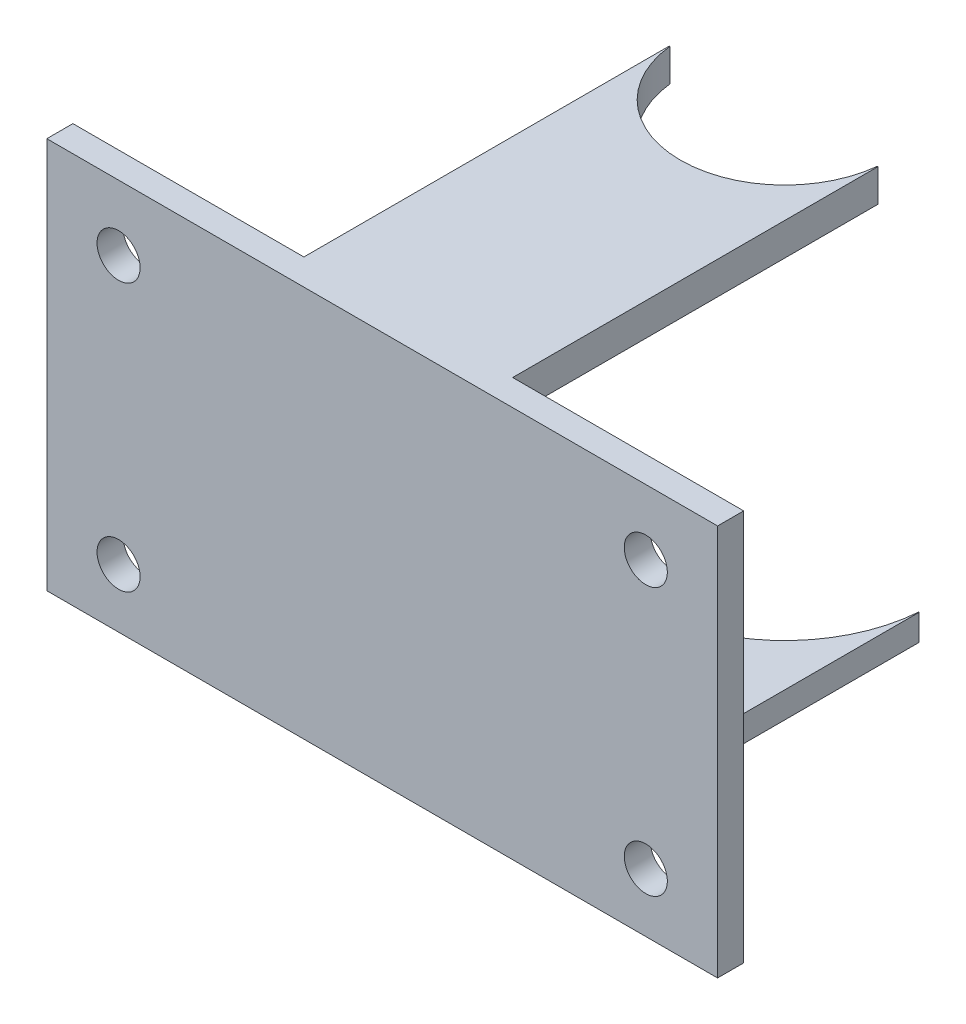
ISO-10303-21;
HEADER;
FILE_DESCRIPTION(('STEP AP214'),'2;1');
FILE_NAME('part.step','',(''),(''),'','','');
FILE_SCHEMA(('AUTOMOTIVE_DESIGN { 1 0 10303 214 1 1 1 1 }'));
ENDSEC;
DATA;
#1=APPLICATION_CONTEXT('core data for automotive mechanical design processes');
#2=APPLICATION_PROTOCOL_DEFINITION('international standard','automotive_design',2000,#1);
#3=PRODUCT_CONTEXT('',#1,'mechanical');
#4=PRODUCT('Part','Part','',(#3));
#5=PRODUCT_RELATED_PRODUCT_CATEGORY('part','',(#4));
#6=PRODUCT_DEFINITION_FORMATION('','',#4);
#7=PRODUCT_DEFINITION_CONTEXT('part definition',#1,'design');
#8=PRODUCT_DEFINITION('design','',#6,#7);
#9=PRODUCT_DEFINITION_SHAPE('','',#8);
#10=(LENGTH_UNIT() NAMED_UNIT(*) SI_UNIT(.MILLI.,.METRE.));
#11=(NAMED_UNIT(*) PLANE_ANGLE_UNIT() SI_UNIT($,.RADIAN.));
#12=(NAMED_UNIT(*) SI_UNIT($,.STERADIAN.) SOLID_ANGLE_UNIT());
#13=UNCERTAINTY_MEASURE_WITH_UNIT(LENGTH_MEASURE(1.E-05),#10,'distance_accuracy_value','');
#14=(GEOMETRIC_REPRESENTATION_CONTEXT(3) GLOBAL_UNCERTAINTY_ASSIGNED_CONTEXT((#13)) GLOBAL_UNIT_ASSIGNED_CONTEXT((#10,
#11,#12)) REPRESENTATION_CONTEXT('',''));
#15=CARTESIAN_POINT('',(0.,0.,0.));
#16=DIRECTION('',(0.,0.,1.));
#17=DIRECTION('',(1.,0.,0.));
#18=AXIS2_PLACEMENT_3D('',#15,#16,#17);
#19=CARTESIAN_POINT('',(0.,0.,-28.));
#20=DIRECTION('',(0.,0.,-1.));
#21=DIRECTION('',(-1.,0.,0.));
#22=AXIS2_PLACEMENT_3D('',#19,#20,#21);
#23=PLANE('',#22);
#24=DIRECTION('',(0.,1.,0.));
#25=VECTOR('',#24,1.);
#26=CARTESIAN_POINT('',(14.5824463122502,-8.00000000000001,-28.));
#27=LINE('',#26,#25);
#28=CARTESIAN_POINT('',(14.5824463122502,0.,-28.));
#29=VERTEX_POINT('',#28);
#30=CARTESIAN_POINT('',(14.5824463122502,1.99999999999999,-28.));
#31=VERTEX_POINT('',#30);
#32=EDGE_CURVE('E11',#29,#31,#27,.T.);
#33=ORIENTED_EDGE('',*,*,#32,.F.);
#34=DIRECTION('',(-1.,0.,0.));
#35=VECTOR('',#34,1.);
#36=CARTESIAN_POINT('',(36.85,0.,-28.));
#37=LINE('',#36,#35);
#38=CARTESIAN_POINT('',(14.55,0.,-28.));
#39=VERTEX_POINT('',#38);
#40=EDGE_CURVE('E285',#29,#39,#37,.T.);
#41=ORIENTED_EDGE('',*,*,#40,.T.);
#42=DIRECTION('',(0.,1.,0.));
#43=VECTOR('',#42,1.);
#44=CARTESIAN_POINT('',(14.55,1.99999999999999,-28.));
#45=LINE('',#44,#43);
#46=CARTESIAN_POINT('',(14.55,1.99999999999999,-28.));
#47=VERTEX_POINT('',#46);
#48=EDGE_CURVE('E158',#39,#47,#45,.T.);
#49=ORIENTED_EDGE('',*,*,#48,.T.);
#50=DIRECTION('',(1.,0.,0.));
#51=VECTOR('',#50,1.);
#52=CARTESIAN_POINT('',(36.85,1.99999999999999,-28.));
#53=LINE('',#52,#51);
#54=EDGE_CURVE('E153',#47,#31,#53,.T.);
#55=ORIENTED_EDGE('',*,*,#54,.T.);
#56=EDGE_LOOP('',(#33,#41,#49,#55));
#57=FACE_BOUND('',#56,.T.);
#58=ADVANCED_FACE('F33',(#57),#23,.T.);
#59=CARTESIAN_POINT('',(0.,0.,-28.));
#60=DIRECTION('',(0.,0.,1.));
#61=DIRECTION('',(1.,0.,0.));
#62=AXIS2_PLACEMENT_3D('',#59,#60,#61);
#63=PLANE('',#62);
#64=DIRECTION('',(-1.,0.,0.));
#65=VECTOR('',#64,1.);
#66=CARTESIAN_POINT('',(33.7,27.5,-28.));
#67=LINE('',#66,#65);
#68=CARTESIAN_POINT('',(33.7,27.5,-28.));
#69=VERTEX_POINT('',#68);
#70=CARTESIAN_POINT('',(33.6547155825962,27.5,-28.));
#71=VERTEX_POINT('',#70);
#72=EDGE_CURVE('E188',#69,#71,#67,.T.);
#73=ORIENTED_EDGE('',*,*,#72,.T.);
#74=DIRECTION('',(0.,1.,0.));
#75=VECTOR('',#74,1.);
#76=CARTESIAN_POINT('',(33.6547155825962,20.,-28.));
#77=LINE('',#76,#75);
#78=CARTESIAN_POINT('',(33.6547155825962,30.,-28.));
#79=VERTEX_POINT('',#78);
#80=EDGE_CURVE('E276',#71,#79,#77,.T.);
#81=ORIENTED_EDGE('',*,*,#80,.T.);
#82=DIRECTION('',(1.,0.,0.));
#83=VECTOR('',#82,1.);
#84=CARTESIAN_POINT('',(33.7,30.,-28.));
#85=LINE('',#84,#83);
#86=CARTESIAN_POINT('',(33.7,30.,-28.));
#87=VERTEX_POINT('',#86);
#88=EDGE_CURVE('E193',#79,#87,#85,.T.);
#89=ORIENTED_EDGE('',*,*,#88,.T.);
#90=DIRECTION('',(0.,-1.,0.));
#91=VECTOR('',#90,1.);
#92=CARTESIAN_POINT('',(33.7,27.5,-28.));
#93=LINE('',#92,#91);
#94=EDGE_CURVE('E183',#87,#69,#93,.T.);
#95=ORIENTED_EDGE('',*,*,#94,.T.);
#96=EDGE_LOOP('',(#73,#81,#89,#95));
#97=FACE_BOUND('',#96,.T.);
#98=ADVANCED_FACE('F300',(#97),#63,.F.);
#99=CARTESIAN_POINT('',(0.,0.,0.));
#100=DIRECTION('',(0.,0.,-1.));
#101=DIRECTION('',(-1.,0.,0.));
#102=AXIS2_PLACEMENT_3D('',#99,#100,#101);
#103=PLANE('',#102);
#104=CARTESIAN_POINT('',(45.9,4.49999999999997,0.));
#105=DIRECTION('',(0.,0.,-1.));
#106=DIRECTION('',(-1.,0.,0.));
#107=AXIS2_PLACEMENT_3D('',#104,#105,#106);
#108=CIRCLE('',#107,1.65);
#109=CARTESIAN_POINT('',(44.25,4.49999999999997,0.));
#110=VERTEX_POINT('',#109);
#111=EDGE_CURVE('E216',#110,#110,#108,.T.);
#112=ORIENTED_EDGE('',*,*,#111,.F.);
#113=EDGE_LOOP('',(#112));
#114=FACE_BOUND('',#113,.T.);
#115=CARTESIAN_POINT('',(5.49999999999998,4.49999999999998,0.));
#116=DIRECTION('',(0.,0.,-1.));
#117=DIRECTION('',(-1.,0.,0.));
#118=AXIS2_PLACEMENT_3D('',#115,#116,#117);
#119=CIRCLE('',#118,1.65);
#120=CARTESIAN_POINT('',(3.84999999999998,4.49999999999998,0.));
#121=VERTEX_POINT('',#120);
#122=EDGE_CURVE('E221',#121,#121,#119,.T.);
#123=ORIENTED_EDGE('',*,*,#122,.F.);
#124=EDGE_LOOP('',(#123));
#125=FACE_BOUND('',#124,.T.);
#126=CARTESIAN_POINT('',(5.49999999999999,25.,0.));
#127=DIRECTION('',(0.,0.,-1.));
#128=DIRECTION('',(-1.,0.,0.));
#129=AXIS2_PLACEMENT_3D('',#126,#127,#128);
#130=CIRCLE('',#129,1.65);
#131=CARTESIAN_POINT('',(3.84999999999999,25.,0.));
#132=VERTEX_POINT('',#131);
#133=EDGE_CURVE('E217',#132,#132,#130,.T.);
#134=ORIENTED_EDGE('',*,*,#133,.F.);
#135=EDGE_LOOP('',(#134));
#136=FACE_BOUND('',#135,.T.);
#137=CARTESIAN_POINT('',(45.9,25.,0.));
#138=DIRECTION('',(0.,0.,-1.));
#139=DIRECTION('',(-1.,0.,0.));
#140=AXIS2_PLACEMENT_3D('',#137,#138,#139);
#141=CIRCLE('',#140,1.65);
#142=CARTESIAN_POINT('',(44.25,25.,0.));
#143=VERTEX_POINT('',#142);
#144=EDGE_CURVE('E220',#143,#143,#141,.T.);
#145=ORIENTED_EDGE('',*,*,#144,.F.);
#146=EDGE_LOOP('',(#145));
#147=FACE_BOUND('',#146,.T.);
#148=DIRECTION('',(1.,0.,0.));
#149=VECTOR('',#148,1.);
#150=CARTESIAN_POINT('',(0.,0.,0.));
#151=LINE('',#150,#149);
#152=CARTESIAN_POINT('',(36.85,0.,0.));
#153=VERTEX_POINT('',#152);
#154=CARTESIAN_POINT('',(51.4,0.,0.));
#155=VERTEX_POINT('',#154);
#156=EDGE_CURVE('E254',#153,#155,#151,.T.);
#157=ORIENTED_EDGE('',*,*,#156,.F.);
#158=DIRECTION('',(0.,-1.,0.));
#159=VECTOR('',#158,1.);
#160=CARTESIAN_POINT('',(36.85,1.99999999999999,0.));
#161=LINE('',#160,#159);
#162=CARTESIAN_POINT('',(36.85,1.99999999999999,0.));
#163=VERTEX_POINT('',#162);
#164=EDGE_CURVE('E168',#163,#153,#161,.T.);
#165=ORIENTED_EDGE('',*,*,#164,.F.);
#166=DIRECTION('',(1.,0.,0.));
#167=VECTOR('',#166,1.);
#168=CARTESIAN_POINT('',(36.85,1.99999999999999,0.));
#169=LINE('',#168,#167);
#170=CARTESIAN_POINT('',(14.55,1.99999999999999,0.));
#171=VERTEX_POINT('',#170);
#172=EDGE_CURVE('E174',#171,#163,#169,.T.);
#173=ORIENTED_EDGE('',*,*,#172,.F.);
#174=DIRECTION('',(0.,1.,0.));
#175=VECTOR('',#174,1.);
#176=CARTESIAN_POINT('',(14.55,1.99999999999999,0.));
#177=LINE('',#176,#175);
#178=CARTESIAN_POINT('',(14.55,0.,0.));
#179=VERTEX_POINT('',#178);
#180=EDGE_CURVE('E171',#179,#171,#177,.T.);
#181=ORIENTED_EDGE('',*,*,#180,.F.);
#182=CARTESIAN_POINT('',(0.,0.,0.));
#183=VERTEX_POINT('',#182);
#184=EDGE_CURVE('E255',#183,#179,#151,.T.);
#185=ORIENTED_EDGE('',*,*,#184,.F.);
#186=DIRECTION('',(0.,-1.,0.));
#187=VECTOR('',#186,1.);
#188=CARTESIAN_POINT('',(0.,0.,0.));
#189=LINE('',#188,#187);
#190=CARTESIAN_POINT('',(0.,30.,0.));
#191=VERTEX_POINT('',#190);
#192=EDGE_CURVE('E240',#191,#183,#189,.T.);
#193=ORIENTED_EDGE('',*,*,#192,.F.);
#194=DIRECTION('',(-1.,0.,0.));
#195=VECTOR('',#194,1.);
#196=CARTESIAN_POINT('',(0.,30.,0.));
#197=LINE('',#196,#195);
#198=CARTESIAN_POINT('',(17.7,30.,0.));
#199=VERTEX_POINT('',#198);
#200=EDGE_CURVE('E260',#199,#191,#197,.T.);
#201=ORIENTED_EDGE('',*,*,#200,.F.);
#202=DIRECTION('',(0.,1.,0.));
#203=VECTOR('',#202,1.);
#204=CARTESIAN_POINT('',(17.7,27.5,0.));
#205=LINE('',#204,#203);
#206=CARTESIAN_POINT('',(17.7,27.5,0.));
#207=VERTEX_POINT('',#206);
#208=EDGE_CURVE('E187',#207,#199,#205,.T.);
#209=ORIENTED_EDGE('',*,*,#208,.F.);
#210=DIRECTION('',(-1.,0.,0.));
#211=VECTOR('',#210,1.);
#212=CARTESIAN_POINT('',(33.7,27.5,0.));
#213=LINE('',#212,#211);
#214=CARTESIAN_POINT('',(33.7,27.5,0.));
#215=VERTEX_POINT('',#214);
#216=EDGE_CURVE('E200',#215,#207,#213,.T.);
#217=ORIENTED_EDGE('',*,*,#216,.F.);
#218=DIRECTION('',(0.,-1.,0.));
#219=VECTOR('',#218,1.);
#220=CARTESIAN_POINT('',(33.7,27.5,0.));
#221=LINE('',#220,#219);
#222=CARTESIAN_POINT('',(33.7,30.,0.));
#223=VERTEX_POINT('',#222);
#224=EDGE_CURVE('E182',#223,#215,#221,.T.);
#225=ORIENTED_EDGE('',*,*,#224,.F.);
#226=CARTESIAN_POINT('',(51.4,30.,0.));
#227=VERTEX_POINT('',#226);
#228=EDGE_CURVE('E245',#227,#223,#197,.T.);
#229=ORIENTED_EDGE('',*,*,#228,.F.);
#230=DIRECTION('',(0.,1.,0.));
#231=VECTOR('',#230,1.);
#232=CARTESIAN_POINT('',(51.4,0.,0.));
#233=LINE('',#232,#231);
#234=EDGE_CURVE('E258',#155,#227,#233,.T.);
#235=ORIENTED_EDGE('',*,*,#234,.F.);
#236=EDGE_LOOP('',(#157,#165,#173,#181,#185,#193,#201,#209,#217,#225,#229,#235));
#237=FACE_BOUND('',#236,.T.);
#238=ADVANCED_FACE('F321',(#114,#125,#136,#147,#237),#103,.T.);
#239=CARTESIAN_POINT('',(0.,0.,2.));
#240=DIRECTION('',(1.,0.,0.));
#241=DIRECTION('',(0.,1.,0.));
#242=AXIS2_PLACEMENT_3D('',#239,#240,#241);
#243=PLANE('',#242);
#244=ORIENTED_EDGE('',*,*,#192,.T.);
#245=DIRECTION('',(0.,0.,-1.));
#246=VECTOR('',#245,1.);
#247=CARTESIAN_POINT('',(0.,0.,2.));
#248=LINE('',#247,#246);
#249=CARTESIAN_POINT('',(0.,0.,2.));
#250=VERTEX_POINT('',#249);
#251=EDGE_CURVE('E271',#250,#183,#248,.T.);
#252=ORIENTED_EDGE('',*,*,#251,.F.);
#253=DIRECTION('',(0.,-1.,0.));
#254=VECTOR('',#253,1.);
#255=CARTESIAN_POINT('',(0.,0.,2.));
#256=LINE('',#255,#254);
#257=CARTESIAN_POINT('',(0.,30.,2.));
#258=VERTEX_POINT('',#257);
#259=EDGE_CURVE('E241',#258,#250,#256,.T.);
#260=ORIENTED_EDGE('',*,*,#259,.F.);
#261=DIRECTION('',(0.,0.,-1.));
#262=VECTOR('',#261,1.);
#263=CARTESIAN_POINT('',(0.,30.,2.));
#264=LINE('',#263,#262);
#265=EDGE_CURVE('E251',#258,#191,#264,.T.);
#266=ORIENTED_EDGE('',*,*,#265,.T.);
#267=EDGE_LOOP('',(#244,#252,#260,#266));
#268=FACE_BOUND('',#267,.T.);
#269=ADVANCED_FACE('F35',(#268),#243,.F.);
#270=CARTESIAN_POINT('',(0.,0.,2.));
#271=DIRECTION('',(0.,1.,0.));
#272=DIRECTION('',(0.,0.,1.));
#273=AXIS2_PLACEMENT_3D('',#270,#271,#272);
#274=PLANE('',#273);
#275=ORIENTED_EDGE('',*,*,#40,.F.);
#276=CARTESIAN_POINT('',(25.7,0.,-28.8500000000009));
#277=DIRECTION('',(0.,1.,0.));
#278=DIRECTION('',(0.,0.,1.));
#279=AXIS2_PLACEMENT_3D('',#276,#277,#278);
#280=CIRCLE('',#279,11.15);
#281=CARTESIAN_POINT('',(36.8175536877498,0.,-28.));
#282=VERTEX_POINT('',#281);
#283=EDGE_CURVE('E145',#29,#282,#280,.T.);
#284=ORIENTED_EDGE('',*,*,#283,.T.);
#285=CARTESIAN_POINT('',(36.85,0.,-28.));
#286=VERTEX_POINT('',#285);
#287=EDGE_CURVE('E282',#286,#282,#37,.T.);
#288=ORIENTED_EDGE('',*,*,#287,.F.);
#289=DIRECTION('',(0.,0.,1.));
#290=VECTOR('',#289,1.);
#291=CARTESIAN_POINT('',(36.85,0.,-28.));
#292=LINE('',#291,#290);
#293=EDGE_CURVE('E180',#286,#153,#292,.T.);
#294=ORIENTED_EDGE('',*,*,#293,.T.);
#295=ORIENTED_EDGE('',*,*,#156,.T.);
#296=DIRECTION('',(0.,0.,-1.));
#297=VECTOR('',#296,1.);
#298=CARTESIAN_POINT('',(51.4,0.,2.));
#299=LINE('',#298,#297);
#300=CARTESIAN_POINT('',(51.4,0.,2.));
#301=VERTEX_POINT('',#300);
#302=EDGE_CURVE('E268',#301,#155,#299,.T.);
#303=ORIENTED_EDGE('',*,*,#302,.F.);
#304=DIRECTION('',(1.,0.,0.));
#305=VECTOR('',#304,1.);
#306=CARTESIAN_POINT('',(0.,0.,2.));
#307=LINE('',#306,#305);
#308=EDGE_CURVE('E244',#250,#301,#307,.T.);
#309=ORIENTED_EDGE('',*,*,#308,.F.);
#310=ORIENTED_EDGE('',*,*,#251,.T.);
#311=ORIENTED_EDGE('',*,*,#184,.T.);
#312=DIRECTION('',(0.,0.,1.));
#313=VECTOR('',#312,1.);
#314=CARTESIAN_POINT('',(14.55,0.,-28.));
#315=LINE('',#314,#313);
#316=EDGE_CURVE('E178',#39,#179,#315,.T.);
#317=ORIENTED_EDGE('',*,*,#316,.F.);
#318=EDGE_LOOP('',(#275,#284,#288,#294,#295,#303,#309,#310,#311,#317));
#319=FACE_BOUND('',#318,.T.);
#320=ADVANCED_FACE('F281',(#319),#274,.F.);
#321=CARTESIAN_POINT('',(51.4,0.,2.));
#322=DIRECTION('',(-1.,0.,0.));
#323=DIRECTION('',(0.,-1.,0.));
#324=AXIS2_PLACEMENT_3D('',#321,#322,#323);
#325=PLANE('',#324);
#326=ORIENTED_EDGE('',*,*,#234,.T.);
#327=DIRECTION('',(0.,0.,-1.));
#328=VECTOR('',#327,1.);
#329=CARTESIAN_POINT('',(51.4,30.,2.));
#330=LINE('',#329,#328);
#331=CARTESIAN_POINT('',(51.4,30.,2.));
#332=VERTEX_POINT('',#331);
#333=EDGE_CURVE('E265',#332,#227,#330,.T.);
#334=ORIENTED_EDGE('',*,*,#333,.F.);
#335=DIRECTION('',(0.,1.,0.));
#336=VECTOR('',#335,1.);
#337=CARTESIAN_POINT('',(51.4,0.,2.));
#338=LINE('',#337,#336);
#339=EDGE_CURVE('E247',#301,#332,#338,.T.);
#340=ORIENTED_EDGE('',*,*,#339,.F.);
#341=ORIENTED_EDGE('',*,*,#302,.T.);
#342=EDGE_LOOP('',(#326,#334,#340,#341));
#343=FACE_BOUND('',#342,.T.);
#344=ADVANCED_FACE('F334',(#343),#325,.F.);
#345=CARTESIAN_POINT('',(0.,30.,2.));
#346=DIRECTION('',(0.,-1.,0.));
#347=DIRECTION('',(0.,0.,-1.));
#348=AXIS2_PLACEMENT_3D('',#345,#346,#347);
#349=PLANE('',#348);
#350=ORIENTED_EDGE('',*,*,#88,.F.);
#351=CARTESIAN_POINT('',(25.7,30.,-28.8500000000009));
#352=DIRECTION('',(0.,1.,0.));
#353=DIRECTION('',(0.,0.,1.));
#354=AXIS2_PLACEMENT_3D('',#351,#352,#353);
#355=CIRCLE('',#354,8.);
#356=CARTESIAN_POINT('',(17.7452844174038,30.,-28.));
#357=VERTEX_POINT('',#356);
#358=EDGE_CURVE('E286',#357,#79,#355,.T.);
#359=ORIENTED_EDGE('',*,*,#358,.F.);
#360=CARTESIAN_POINT('',(17.7,30.,-28.));
#361=VERTEX_POINT('',#360);
#362=EDGE_CURVE('E194',#361,#357,#85,.T.);
#363=ORIENTED_EDGE('',*,*,#362,.F.);
#364=DIRECTION('',(0.,0.,1.));
#365=VECTOR('',#364,1.);
#366=CARTESIAN_POINT('',(17.7,30.,-28.));
#367=LINE('',#366,#365);
#368=EDGE_CURVE('E207',#361,#199,#367,.T.);
#369=ORIENTED_EDGE('',*,*,#368,.T.);
#370=ORIENTED_EDGE('',*,*,#200,.T.);
#371=ORIENTED_EDGE('',*,*,#265,.F.);
#372=DIRECTION('',(-1.,0.,0.));
#373=VECTOR('',#372,1.);
#374=CARTESIAN_POINT('',(0.,30.,2.));
#375=LINE('',#374,#373);
#376=EDGE_CURVE('E249',#332,#258,#375,.T.);
#377=ORIENTED_EDGE('',*,*,#376,.F.);
#378=ORIENTED_EDGE('',*,*,#333,.T.);
#379=ORIENTED_EDGE('',*,*,#228,.T.);
#380=DIRECTION('',(0.,0.,1.));
#381=VECTOR('',#380,1.);
#382=CARTESIAN_POINT('',(33.7,30.,-28.));
#383=LINE('',#382,#381);
#384=EDGE_CURVE('E197',#87,#223,#383,.T.);
#385=ORIENTED_EDGE('',*,*,#384,.F.);
#386=EDGE_LOOP('',(#350,#359,#363,#369,#370,#371,#377,#378,#379,#385));
#387=FACE_BOUND('',#386,.T.);
#388=ADVANCED_FACE('F302',(#387),#349,.F.);
#389=CARTESIAN_POINT('',(0.,0.,2.));
#390=DIRECTION('',(0.,0.,-1.));
#391=DIRECTION('',(-1.,0.,0.));
#392=AXIS2_PLACEMENT_3D('',#389,#390,#391);
#393=PLANE('',#392);
#394=CARTESIAN_POINT('',(45.9,4.49999999999997,2.));
#395=DIRECTION('',(0.,0.,-1.));
#396=DIRECTION('',(-1.,0.,0.));
#397=AXIS2_PLACEMENT_3D('',#394,#395,#396);
#398=CIRCLE('',#397,1.65);
#399=CARTESIAN_POINT('',(44.25,4.49999999999997,2.));
#400=VERTEX_POINT('',#399);
#401=EDGE_CURVE('E237',#400,#400,#398,.T.);
#402=ORIENTED_EDGE('',*,*,#401,.T.);
#403=EDGE_LOOP('',(#402));
#404=FACE_BOUND('',#403,.T.);
#405=CARTESIAN_POINT('',(5.49999999999998,4.49999999999998,2.));
#406=DIRECTION('',(0.,0.,-1.));
#407=DIRECTION('',(-1.,0.,0.));
#408=AXIS2_PLACEMENT_3D('',#405,#406,#407);
#409=CIRCLE('',#408,1.65);
#410=CARTESIAN_POINT('',(3.84999999999998,4.49999999999998,2.));
#411=VERTEX_POINT('',#410);
#412=EDGE_CURVE('E234',#411,#411,#409,.T.);
#413=ORIENTED_EDGE('',*,*,#412,.T.);
#414=EDGE_LOOP('',(#413));
#415=FACE_BOUND('',#414,.T.);
#416=CARTESIAN_POINT('',(5.49999999999999,25.,2.));
#417=DIRECTION('',(0.,0.,-1.));
#418=DIRECTION('',(-1.,0.,0.));
#419=AXIS2_PLACEMENT_3D('',#416,#417,#418);
#420=CIRCLE('',#419,1.65);
#421=CARTESIAN_POINT('',(3.84999999999999,25.,2.));
#422=VERTEX_POINT('',#421);
#423=EDGE_CURVE('E231',#422,#422,#420,.T.);
#424=ORIENTED_EDGE('',*,*,#423,.T.);
#425=EDGE_LOOP('',(#424));
#426=FACE_BOUND('',#425,.T.);
#427=CARTESIAN_POINT('',(45.9,25.,2.));
#428=DIRECTION('',(0.,0.,-1.));
#429=DIRECTION('',(-1.,0.,0.));
#430=AXIS2_PLACEMENT_3D('',#427,#428,#429);
#431=CIRCLE('',#430,1.65);
#432=CARTESIAN_POINT('',(44.25,25.,2.));
#433=VERTEX_POINT('',#432);
#434=EDGE_CURVE('E228',#433,#433,#431,.T.);
#435=ORIENTED_EDGE('',*,*,#434,.T.);
#436=EDGE_LOOP('',(#435));
#437=FACE_BOUND('',#436,.T.);
#438=ORIENTED_EDGE('',*,*,#259,.T.);
#439=ORIENTED_EDGE('',*,*,#308,.T.);
#440=ORIENTED_EDGE('',*,*,#339,.T.);
#441=ORIENTED_EDGE('',*,*,#376,.T.);
#442=EDGE_LOOP('',(#438,#439,#440,#441));
#443=FACE_BOUND('',#442,.T.);
#444=ADVANCED_FACE('F330',(#404,#415,#426,#437,#443),#393,.F.);
#445=CARTESIAN_POINT('',(45.9,25.,15.));
#446=DIRECTION('',(0.,0.,-1.));
#447=DIRECTION('',(-1.,0.,0.));
#448=AXIS2_PLACEMENT_3D('',#445,#446,#447);
#449=CYLINDRICAL_SURFACE('',#448,1.65);
#450=ORIENTED_EDGE('',*,*,#144,.T.);
#451=EDGE_LOOP('',(#450));
#452=FACE_BOUND('',#451,.T.);
#453=ORIENTED_EDGE('',*,*,#434,.F.);
#454=EDGE_LOOP('',(#453));
#455=FACE_BOUND('',#454,.T.);
#456=ADVANCED_FACE('F491',(#452,#455),#449,.F.);
#457=CARTESIAN_POINT('',(5.49999999999999,25.,15.));
#458=DIRECTION('',(0.,0.,-1.));
#459=DIRECTION('',(-1.,0.,0.));
#460=AXIS2_PLACEMENT_3D('',#457,#458,#459);
#461=CYLINDRICAL_SURFACE('',#460,1.65);
#462=ORIENTED_EDGE('',*,*,#133,.T.);
#463=EDGE_LOOP('',(#462));
#464=FACE_BOUND('',#463,.T.);
#465=ORIENTED_EDGE('',*,*,#423,.F.);
#466=EDGE_LOOP('',(#465));
#467=FACE_BOUND('',#466,.T.);
#468=ADVANCED_FACE('F481',(#464,#467),#461,.F.);
#469=CARTESIAN_POINT('',(5.49999999999998,4.49999999999998,15.));
#470=DIRECTION('',(0.,0.,-1.));
#471=DIRECTION('',(-1.,0.,0.));
#472=AXIS2_PLACEMENT_3D('',#469,#470,#471);
#473=CYLINDRICAL_SURFACE('',#472,1.65);
#474=ORIENTED_EDGE('',*,*,#122,.T.);
#475=EDGE_LOOP('',(#474));
#476=FACE_BOUND('',#475,.T.);
#477=ORIENTED_EDGE('',*,*,#412,.F.);
#478=EDGE_LOOP('',(#477));
#479=FACE_BOUND('',#478,.T.);
#480=ADVANCED_FACE('F471',(#476,#479),#473,.F.);
#481=CARTESIAN_POINT('',(45.9,4.49999999999997,15.));
#482=DIRECTION('',(0.,0.,-1.));
#483=DIRECTION('',(-1.,0.,0.));
#484=AXIS2_PLACEMENT_3D('',#481,#482,#483);
#485=CYLINDRICAL_SURFACE('',#484,1.65);
#486=ORIENTED_EDGE('',*,*,#111,.T.);
#487=EDGE_LOOP('',(#486));
#488=FACE_BOUND('',#487,.T.);
#489=ORIENTED_EDGE('',*,*,#401,.F.);
#490=EDGE_LOOP('',(#489));
#491=FACE_BOUND('',#490,.T.);
#492=ADVANCED_FACE('F455',(#488,#491),#485,.F.);
#493=CARTESIAN_POINT('',(33.7,27.5,-28.));
#494=DIRECTION('',(-1.,0.,0.));
#495=DIRECTION('',(0.,0.,1.));
#496=AXIS2_PLACEMENT_3D('',#493,#494,#495);
#497=PLANE('',#496);
#498=ORIENTED_EDGE('',*,*,#224,.T.);
#499=DIRECTION('',(0.,0.,1.));
#500=VECTOR('',#499,1.);
#501=CARTESIAN_POINT('',(33.7,27.5,-28.));
#502=LINE('',#501,#500);
#503=EDGE_CURVE('E213',#69,#215,#502,.T.);
#504=ORIENTED_EDGE('',*,*,#503,.F.);
#505=ORIENTED_EDGE('',*,*,#94,.F.);
#506=ORIENTED_EDGE('',*,*,#384,.T.);
#507=EDGE_LOOP('',(#498,#504,#505,#506));
#508=FACE_BOUND('',#507,.T.);
#509=ADVANCED_FACE('F307',(#508),#497,.F.);
#510=CARTESIAN_POINT('',(33.7,27.5,-28.));
#511=DIRECTION('',(0.,1.,0.));
#512=DIRECTION('',(0.,0.,1.));
#513=AXIS2_PLACEMENT_3D('',#510,#511,#512);
#514=PLANE('',#513);
#515=CARTESIAN_POINT('',(17.7452844174038,27.5,-28.));
#516=VERTEX_POINT('',#515);
#517=CARTESIAN_POINT('',(17.7,27.5,-28.));
#518=VERTEX_POINT('',#517);
#519=EDGE_CURVE('E186',#516,#518,#67,.T.);
#520=ORIENTED_EDGE('',*,*,#519,.F.);
#521=CARTESIAN_POINT('',(25.7,27.5,-28.8500000000009));
#522=DIRECTION('',(0.,1.,0.));
#523=DIRECTION('',(0.,0.,1.));
#524=AXIS2_PLACEMENT_3D('',#521,#522,#523);
#525=CIRCLE('',#524,8.);
#526=EDGE_CURVE('E55',#516,#71,#525,.T.);
#527=ORIENTED_EDGE('',*,*,#526,.T.);
#528=ORIENTED_EDGE('',*,*,#72,.F.);
#529=ORIENTED_EDGE('',*,*,#503,.T.);
#530=ORIENTED_EDGE('',*,*,#216,.T.);
#531=DIRECTION('',(0.,0.,1.));
#532=VECTOR('',#531,1.);
#533=CARTESIAN_POINT('',(17.7,27.5,-28.));
#534=LINE('',#533,#532);
#535=EDGE_CURVE('E210',#518,#207,#534,.T.);
#536=ORIENTED_EDGE('',*,*,#535,.F.);
#537=EDGE_LOOP('',(#520,#527,#528,#529,#530,#536));
#538=FACE_BOUND('',#537,.T.);
#539=ADVANCED_FACE('F310',(#538),#514,.F.);
#540=CARTESIAN_POINT('',(17.7,27.5,-28.));
#541=DIRECTION('',(1.,0.,0.));
#542=DIRECTION('',(0.,0.,-1.));
#543=AXIS2_PLACEMENT_3D('',#540,#541,#542);
#544=PLANE('',#543);
#545=ORIENTED_EDGE('',*,*,#208,.T.);
#546=ORIENTED_EDGE('',*,*,#368,.F.);
#547=DIRECTION('',(0.,1.,0.));
#548=VECTOR('',#547,1.);
#549=CARTESIAN_POINT('',(17.7,27.5,-28.));
#550=LINE('',#549,#548);
#551=EDGE_CURVE('E191',#518,#361,#550,.T.);
#552=ORIENTED_EDGE('',*,*,#551,.F.);
#553=ORIENTED_EDGE('',*,*,#535,.T.);
#554=EDGE_LOOP('',(#545,#546,#552,#553));
#555=FACE_BOUND('',#554,.T.);
#556=ADVANCED_FACE('F318',(#555),#544,.F.);
#557=ORIENTED_EDGE('',*,*,#362,.T.);
#558=DIRECTION('',(0.,1.,0.));
#559=VECTOR('',#558,1.);
#560=CARTESIAN_POINT('',(17.7452844174038,20.,-28.));
#561=LINE('',#560,#559);
#562=EDGE_CURVE('E274',#357,#516,#561,.F.);
#563=ORIENTED_EDGE('',*,*,#562,.T.);
#564=ORIENTED_EDGE('',*,*,#519,.T.);
#565=ORIENTED_EDGE('',*,*,#551,.T.);
#566=EDGE_LOOP('',(#557,#563,#564,#565));
#567=FACE_BOUND('',#566,.T.);
#568=ADVANCED_FACE('F314',(#567),#63,.F.);
#569=CARTESIAN_POINT('',(36.85,1.99999999999999,-28.));
#570=DIRECTION('',(-1.,0.,0.));
#571=DIRECTION('',(0.,0.,1.));
#572=AXIS2_PLACEMENT_3D('',#569,#570,#571);
#573=PLANE('',#572);
#574=ORIENTED_EDGE('',*,*,#164,.T.);
#575=ORIENTED_EDGE('',*,*,#293,.F.);
#576=DIRECTION('',(0.,-1.,0.));
#577=VECTOR('',#576,1.);
#578=CARTESIAN_POINT('',(36.85,1.99999999999999,-28.));
#579=LINE('',#578,#577);
#580=CARTESIAN_POINT('',(36.85,1.99999999999999,-28.));
#581=VERTEX_POINT('',#580);
#582=EDGE_CURVE('E175',#581,#286,#579,.T.);
#583=ORIENTED_EDGE('',*,*,#582,.F.);
#584=DIRECTION('',(0.,0.,1.));
#585=VECTOR('',#584,1.);
#586=CARTESIAN_POINT('',(36.85,1.99999999999999,-28.));
#587=LINE('',#586,#585);
#588=EDGE_CURVE('E160',#581,#163,#587,.T.);
#589=ORIENTED_EDGE('',*,*,#588,.T.);
#590=EDGE_LOOP('',(#574,#575,#583,#589));
#591=FACE_BOUND('',#590,.T.);
#592=ADVANCED_FACE('F339',(#591),#573,.F.);
#593=CARTESIAN_POINT('',(14.55,1.99999999999999,-28.));
#594=DIRECTION('',(1.,0.,0.));
#595=DIRECTION('',(0.,1.,0.));
#596=AXIS2_PLACEMENT_3D('',#593,#594,#595);
#597=PLANE('',#596);
#598=ORIENTED_EDGE('',*,*,#180,.T.);
#599=DIRECTION('',(0.,0.,1.));
#600=VECTOR('',#599,1.);
#601=CARTESIAN_POINT('',(14.55,1.99999999999999,-28.));
#602=LINE('',#601,#600);
#603=EDGE_CURVE('E163',#47,#171,#602,.T.);
#604=ORIENTED_EDGE('',*,*,#603,.F.);
#605=ORIENTED_EDGE('',*,*,#48,.F.);
#606=ORIENTED_EDGE('',*,*,#316,.T.);
#607=EDGE_LOOP('',(#598,#604,#605,#606));
#608=FACE_BOUND('',#607,.T.);
#609=ADVANCED_FACE('F341',(#608),#597,.F.);
#610=CARTESIAN_POINT('',(36.85,1.99999999999999,-28.));
#611=DIRECTION('',(0.,-1.,0.));
#612=DIRECTION('',(0.,0.,-1.));
#613=AXIS2_PLACEMENT_3D('',#610,#611,#612);
#614=PLANE('',#613);
#615=CARTESIAN_POINT('',(36.8175536877498,1.99999999999999,-28.));
#616=VERTEX_POINT('',#615);
#617=EDGE_CURVE('E155',#616,#581,#53,.T.);
#618=ORIENTED_EDGE('',*,*,#617,.F.);
#619=CARTESIAN_POINT('',(25.7,1.99999999999999,-28.8500000000009));
#620=DIRECTION('',(0.,1.,0.));
#621=DIRECTION('',(-1.,0.,0.));
#622=AXIS2_PLACEMENT_3D('',#619,#620,#621);
#623=CIRCLE('',#622,11.15);
#624=EDGE_CURVE('E47',#31,#616,#623,.T.);
#625=ORIENTED_EDGE('',*,*,#624,.F.);
#626=ORIENTED_EDGE('',*,*,#54,.F.);
#627=ORIENTED_EDGE('',*,*,#603,.T.);
#628=ORIENTED_EDGE('',*,*,#172,.T.);
#629=ORIENTED_EDGE('',*,*,#588,.F.);
#630=EDGE_LOOP('',(#618,#625,#626,#627,#628,#629));
#631=FACE_BOUND('',#630,.T.);
#632=ADVANCED_FACE('F152',(#631),#614,.F.);
#633=DIRECTION('',(0.,1.,0.));
#634=VECTOR('',#633,1.);
#635=CARTESIAN_POINT('',(36.8175536877498,-8.00000000000001,-28.));
#636=LINE('',#635,#634);
#637=EDGE_CURVE('E41',#616,#282,#636,.F.);
#638=ORIENTED_EDGE('',*,*,#637,.F.);
#639=ORIENTED_EDGE('',*,*,#617,.T.);
#640=ORIENTED_EDGE('',*,*,#582,.T.);
#641=ORIENTED_EDGE('',*,*,#287,.T.);
#642=EDGE_LOOP('',(#638,#639,#640,#641));
#643=FACE_BOUND('',#642,.T.);
#644=ADVANCED_FACE('F288',(#643),#23,.T.);
#645=CARTESIAN_POINT('',(25.7,20.,-28.8500000000009));
#646=DIRECTION('',(0.,1.,0.));
#647=DIRECTION('',(0.,0.,1.));
#648=AXIS2_PLACEMENT_3D('',#645,#646,#647);
#649=CYLINDRICAL_SURFACE('',#648,8.);
#650=ORIENTED_EDGE('',*,*,#526,.F.);
#651=ORIENTED_EDGE('',*,*,#562,.F.);
#652=ORIENTED_EDGE('',*,*,#358,.T.);
#653=ORIENTED_EDGE('',*,*,#80,.F.);
#654=EDGE_LOOP('',(#650,#651,#652,#653));
#655=FACE_BOUND('',#654,.T.);
#656=ADVANCED_FACE('F295',(#655),#649,.F.);
#657=CARTESIAN_POINT('',(25.7,-8.00000000000001,-28.8500000000009));
#658=DIRECTION('',(0.,1.,0.));
#659=DIRECTION('',(-1.,0.,0.));
#660=AXIS2_PLACEMENT_3D('',#657,#658,#659);
#661=CYLINDRICAL_SURFACE('',#660,11.15);
#662=ORIENTED_EDGE('',*,*,#32,.T.);
#663=ORIENTED_EDGE('',*,*,#624,.T.);
#664=ORIENTED_EDGE('',*,*,#637,.T.);
#665=ORIENTED_EDGE('',*,*,#283,.F.);
#666=EDGE_LOOP('',(#662,#663,#664,#665));
#667=FACE_BOUND('',#666,.T.);
#668=ADVANCED_FACE('F143',(#667),#661,.F.);
#669=CLOSED_SHELL('',(#58,#98,#238,#269,#320,#344,#388,#444,#456,#468,#480,#492,#509,#539,#556,
#568,#592,#609,#632,#644,#656,#668));
#670=MANIFOLD_SOLID_BREP('B2',#669);
#671=ADVANCED_BREP_SHAPE_REPRESENTATION('',(#18,#670),#14);
#672=SHAPE_DEFINITION_REPRESENTATION(#9,#671);
ENDSEC;
END-ISO-10303-21;
